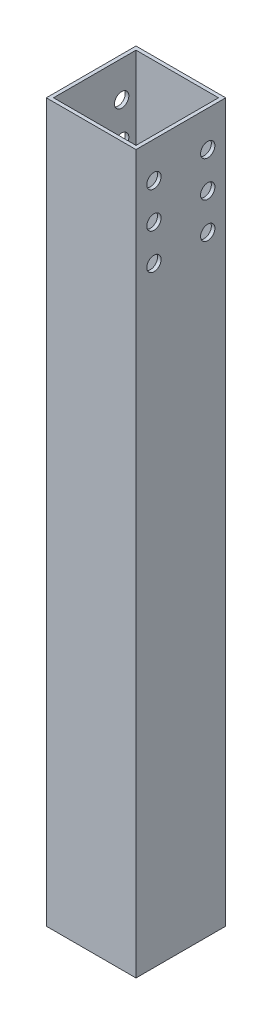
ISO-10303-21;
HEADER;
FILE_DESCRIPTION(('STEP AP214'),'2;1');
FILE_NAME('part.step','',(''),(''),'','','');
FILE_SCHEMA(('AUTOMOTIVE_DESIGN { 1 0 10303 214 1 1 1 1 }'));
ENDSEC;
DATA;
#1=APPLICATION_CONTEXT('core data for automotive mechanical design processes');
#2=APPLICATION_PROTOCOL_DEFINITION('international standard','automotive_design',2000,#1);
#3=PRODUCT_CONTEXT('',#1,'mechanical');
#4=PRODUCT('Part','Part','',(#3));
#5=PRODUCT_RELATED_PRODUCT_CATEGORY('part','',(#4));
#6=PRODUCT_DEFINITION_FORMATION('','',#4);
#7=PRODUCT_DEFINITION_CONTEXT('part definition',#1,'design');
#8=PRODUCT_DEFINITION('design','',#6,#7);
#9=PRODUCT_DEFINITION_SHAPE('','',#8);
#10=(LENGTH_UNIT() NAMED_UNIT(*) SI_UNIT(.MILLI.,.METRE.));
#11=(NAMED_UNIT(*) PLANE_ANGLE_UNIT() SI_UNIT($,.RADIAN.));
#12=(NAMED_UNIT(*) SI_UNIT($,.STERADIAN.) SOLID_ANGLE_UNIT());
#13=UNCERTAINTY_MEASURE_WITH_UNIT(LENGTH_MEASURE(1.E-05),#10,'distance_accuracy_value','');
#14=(GEOMETRIC_REPRESENTATION_CONTEXT(3) GLOBAL_UNCERTAINTY_ASSIGNED_CONTEXT((#13)) GLOBAL_UNIT_ASSIGNED_CONTEXT((#10,
#11,#12)) REPRESENTATION_CONTEXT('',''));
#15=CARTESIAN_POINT('',(0.,0.,0.));
#16=DIRECTION('',(0.,0.,1.));
#17=DIRECTION('',(1.,0.,0.));
#18=AXIS2_PLACEMENT_3D('',#15,#16,#17);
#19=CARTESIAN_POINT('',(0.,200.,0.));
#20=DIRECTION('',(0.,1.,0.));
#21=DIRECTION('',(0.,0.,1.));
#22=AXIS2_PLACEMENT_3D('',#19,#20,#21);
#23=PLANE('',#22);
#24=DIRECTION('',(0.,0.,-1.));
#25=VECTOR('',#24,1.);
#26=CARTESIAN_POINT('',(12.5,200.,-12.5));
#27=LINE('',#26,#25);
#28=CARTESIAN_POINT('',(12.5,200.,12.5));
#29=VERTEX_POINT('',#28);
#30=CARTESIAN_POINT('',(12.5,200.,-12.5));
#31=VERTEX_POINT('',#30);
#32=EDGE_CURVE('E138',#29,#31,#27,.T.);
#33=ORIENTED_EDGE('',*,*,#32,.T.);
#34=DIRECTION('',(-1.,0.,0.));
#35=VECTOR('',#34,1.);
#36=CARTESIAN_POINT('',(-12.5,200.,-12.5));
#37=LINE('',#36,#35);
#38=CARTESIAN_POINT('',(-12.5,200.,-12.5));
#39=VERTEX_POINT('',#38);
#40=EDGE_CURVE('E141',#31,#39,#37,.T.);
#41=ORIENTED_EDGE('',*,*,#40,.T.);
#42=DIRECTION('',(0.,0.,1.));
#43=VECTOR('',#42,1.);
#44=CARTESIAN_POINT('',(-12.5,200.,-12.5));
#45=LINE('',#44,#43);
#46=CARTESIAN_POINT('',(-12.5,200.,12.5));
#47=VERTEX_POINT('',#46);
#48=EDGE_CURVE('E144',#39,#47,#45,.T.);
#49=ORIENTED_EDGE('',*,*,#48,.T.);
#50=DIRECTION('',(1.,0.,0.));
#51=VECTOR('',#50,1.);
#52=CARTESIAN_POINT('',(-12.5,200.,12.5));
#53=LINE('',#52,#51);
#54=EDGE_CURVE('E146',#47,#29,#53,.T.);
#55=ORIENTED_EDGE('',*,*,#54,.T.);
#56=EDGE_LOOP('',(#33,#41,#49,#55));
#57=FACE_BOUND('',#56,.T.);
#58=DIRECTION('',(1.,0.,0.));
#59=VECTOR('',#58,1.);
#60=CARTESIAN_POINT('',(-11.5,200.,11.5));
#61=LINE('',#60,#59);
#62=CARTESIAN_POINT('',(-11.5,200.,11.5));
#63=VERTEX_POINT('',#62);
#64=CARTESIAN_POINT('',(11.5,200.,11.5));
#65=VERTEX_POINT('',#64);
#66=EDGE_CURVE('E108',#63,#65,#61,.T.);
#67=ORIENTED_EDGE('',*,*,#66,.F.);
#68=DIRECTION('',(0.,0.,1.));
#69=VECTOR('',#68,1.);
#70=CARTESIAN_POINT('',(-11.5,200.,-11.5));
#71=LINE('',#70,#69);
#72=CARTESIAN_POINT('',(-11.5,200.,-11.5));
#73=VERTEX_POINT('',#72);
#74=EDGE_CURVE('E100',#73,#63,#71,.T.);
#75=ORIENTED_EDGE('',*,*,#74,.F.);
#76=DIRECTION('',(-1.,0.,0.));
#77=VECTOR('',#76,1.);
#78=CARTESIAN_POINT('',(-11.5,200.,-11.5));
#79=LINE('',#78,#77);
#80=CARTESIAN_POINT('',(11.5,200.,-11.5));
#81=VERTEX_POINT('',#80);
#82=EDGE_CURVE('E122',#81,#73,#79,.T.);
#83=ORIENTED_EDGE('',*,*,#82,.F.);
#84=DIRECTION('',(0.,0.,-1.));
#85=VECTOR('',#84,1.);
#86=CARTESIAN_POINT('',(11.5,200.,-11.5));
#87=LINE('',#86,#85);
#88=EDGE_CURVE('E120',#65,#81,#87,.T.);
#89=ORIENTED_EDGE('',*,*,#88,.F.);
#90=EDGE_LOOP('',(#67,#75,#83,#89));
#91=FACE_BOUND('',#90,.T.);
#92=ADVANCED_FACE('F33',(#57,#91),#23,.T.);
#93=CARTESIAN_POINT('',(0.,0.,0.));
#94=DIRECTION('',(0.,1.,0.));
#95=DIRECTION('',(0.,0.,1.));
#96=AXIS2_PLACEMENT_3D('',#93,#94,#95);
#97=PLANE('',#96);
#98=DIRECTION('',(0.,0.,-1.));
#99=VECTOR('',#98,1.);
#100=CARTESIAN_POINT('',(12.5,0.,-12.5));
#101=LINE('',#100,#99);
#102=CARTESIAN_POINT('',(12.5,0.,12.5));
#103=VERTEX_POINT('',#102);
#104=CARTESIAN_POINT('',(12.5,0.,-12.5));
#105=VERTEX_POINT('',#104);
#106=EDGE_CURVE('E116',#103,#105,#101,.T.);
#107=ORIENTED_EDGE('',*,*,#106,.F.);
#108=DIRECTION('',(1.,0.,0.));
#109=VECTOR('',#108,1.);
#110=CARTESIAN_POINT('',(-12.5,0.,12.5));
#111=LINE('',#110,#109);
#112=CARTESIAN_POINT('',(-12.5,0.,12.5));
#113=VERTEX_POINT('',#112);
#114=EDGE_CURVE('E142',#113,#103,#111,.T.);
#115=ORIENTED_EDGE('',*,*,#114,.F.);
#116=DIRECTION('',(0.,0.,1.));
#117=VECTOR('',#116,1.);
#118=CARTESIAN_POINT('',(-12.5,0.,-12.5));
#119=LINE('',#118,#117);
#120=CARTESIAN_POINT('',(-12.5,0.,-12.5));
#121=VERTEX_POINT('',#120);
#122=EDGE_CURVE('E153',#121,#113,#119,.T.);
#123=ORIENTED_EDGE('',*,*,#122,.F.);
#124=DIRECTION('',(-1.,0.,0.));
#125=VECTOR('',#124,1.);
#126=CARTESIAN_POINT('',(-12.5,0.,-12.5));
#127=LINE('',#126,#125);
#128=EDGE_CURVE('E151',#105,#121,#127,.T.);
#129=ORIENTED_EDGE('',*,*,#128,.F.);
#130=EDGE_LOOP('',(#107,#115,#123,#129));
#131=FACE_BOUND('',#130,.T.);
#132=DIRECTION('',(0.,0.,1.));
#133=VECTOR('',#132,1.);
#134=CARTESIAN_POINT('',(-11.5,0.,-11.5));
#135=LINE('',#134,#133);
#136=CARTESIAN_POINT('',(-11.5,0.,-11.5));
#137=VERTEX_POINT('',#136);
#138=CARTESIAN_POINT('',(-11.5,0.,11.5));
#139=VERTEX_POINT('',#138);
#140=EDGE_CURVE('E58',#137,#139,#135,.T.);
#141=ORIENTED_EDGE('',*,*,#140,.T.);
#142=DIRECTION('',(1.,0.,0.));
#143=VECTOR('',#142,1.);
#144=CARTESIAN_POINT('',(-11.5,0.,11.5));
#145=LINE('',#144,#143);
#146=CARTESIAN_POINT('',(11.5,0.,11.5));
#147=VERTEX_POINT('',#146);
#148=EDGE_CURVE('E115',#139,#147,#145,.T.);
#149=ORIENTED_EDGE('',*,*,#148,.T.);
#150=DIRECTION('',(0.,0.,-1.));
#151=VECTOR('',#150,1.);
#152=CARTESIAN_POINT('',(11.5,0.,-11.5));
#153=LINE('',#152,#151);
#154=CARTESIAN_POINT('',(11.5,0.,-11.5));
#155=VERTEX_POINT('',#154);
#156=EDGE_CURVE('E130',#147,#155,#153,.T.);
#157=ORIENTED_EDGE('',*,*,#156,.T.);
#158=DIRECTION('',(-1.,0.,0.));
#159=VECTOR('',#158,1.);
#160=CARTESIAN_POINT('',(-11.5,0.,-11.5));
#161=LINE('',#160,#159);
#162=EDGE_CURVE('E109',#155,#137,#161,.T.);
#163=ORIENTED_EDGE('',*,*,#162,.T.);
#164=EDGE_LOOP('',(#141,#149,#157,#163));
#165=FACE_BOUND('',#164,.T.);
#166=ADVANCED_FACE('F217',(#131,#165),#97,.F.);
#167=CARTESIAN_POINT('',(12.5,200.,-12.5));
#168=DIRECTION('',(-1.,0.,0.));
#169=DIRECTION('',(0.,0.,1.));
#170=AXIS2_PLACEMENT_3D('',#167,#168,#169);
#171=PLANE('',#170);
#172=CARTESIAN_POINT('',(12.5,180.,-7.5));
#173=DIRECTION('',(1.,0.,0.));
#174=DIRECTION('',(0.,0.,-1.));
#175=AXIS2_PLACEMENT_3D('',#172,#173,#174);
#176=CIRCLE('',#175,2.);
#177=CARTESIAN_POINT('',(12.5,180.,-9.5));
#178=VERTEX_POINT('',#177);
#179=EDGE_CURVE('E270',#178,#178,#176,.T.);
#180=ORIENTED_EDGE('',*,*,#179,.F.);
#181=EDGE_LOOP('',(#180));
#182=FACE_BOUND('',#181,.T.);
#183=CARTESIAN_POINT('',(12.5,170.,-7.5));
#184=DIRECTION('',(1.,0.,0.));
#185=DIRECTION('',(0.,0.,-1.));
#186=AXIS2_PLACEMENT_3D('',#183,#184,#185);
#187=CIRCLE('',#186,2.);
#188=CARTESIAN_POINT('',(12.5,170.,-9.5));
#189=VERTEX_POINT('',#188);
#190=EDGE_CURVE('E274',#189,#189,#187,.T.);
#191=ORIENTED_EDGE('',*,*,#190,.F.);
#192=EDGE_LOOP('',(#191));
#193=FACE_BOUND('',#192,.T.);
#194=CARTESIAN_POINT('',(12.5,190.,7.5));
#195=DIRECTION('',(1.,0.,0.));
#196=DIRECTION('',(0.,0.,-1.));
#197=AXIS2_PLACEMENT_3D('',#194,#195,#196);
#198=CIRCLE('',#197,2.);
#199=CARTESIAN_POINT('',(12.5,190.,5.5));
#200=VERTEX_POINT('',#199);
#201=EDGE_CURVE('E278',#200,#200,#198,.T.);
#202=ORIENTED_EDGE('',*,*,#201,.F.);
#203=EDGE_LOOP('',(#202));
#204=FACE_BOUND('',#203,.T.);
#205=CARTESIAN_POINT('',(12.5,180.,7.5));
#206=DIRECTION('',(1.,0.,0.));
#207=DIRECTION('',(0.,0.,-1.));
#208=AXIS2_PLACEMENT_3D('',#205,#206,#207);
#209=CIRCLE('',#208,2.);
#210=CARTESIAN_POINT('',(12.5,180.,5.5));
#211=VERTEX_POINT('',#210);
#212=EDGE_CURVE('E282',#211,#211,#209,.T.);
#213=ORIENTED_EDGE('',*,*,#212,.F.);
#214=EDGE_LOOP('',(#213));
#215=FACE_BOUND('',#214,.T.);
#216=CARTESIAN_POINT('',(12.5,170.,7.5));
#217=DIRECTION('',(1.,0.,0.));
#218=DIRECTION('',(0.,0.,-1.));
#219=AXIS2_PLACEMENT_3D('',#216,#217,#218);
#220=CIRCLE('',#219,2.);
#221=CARTESIAN_POINT('',(12.5,170.,5.5));
#222=VERTEX_POINT('',#221);
#223=EDGE_CURVE('E286',#222,#222,#220,.T.);
#224=ORIENTED_EDGE('',*,*,#223,.F.);
#225=EDGE_LOOP('',(#224));
#226=FACE_BOUND('',#225,.T.);
#227=CARTESIAN_POINT('',(12.5,190.,-7.5));
#228=DIRECTION('',(1.,0.,0.));
#229=DIRECTION('',(0.,0.,-1.));
#230=AXIS2_PLACEMENT_3D('',#227,#228,#229);
#231=CIRCLE('',#230,2.);
#232=CARTESIAN_POINT('',(12.5,190.,-9.5));
#233=VERTEX_POINT('',#232);
#234=EDGE_CURVE('E289',#233,#233,#231,.T.);
#235=ORIENTED_EDGE('',*,*,#234,.F.);
#236=EDGE_LOOP('',(#235));
#237=FACE_BOUND('',#236,.T.);
#238=ORIENTED_EDGE('',*,*,#106,.T.);
#239=DIRECTION('',(0.,-1.,0.));
#240=VECTOR('',#239,1.);
#241=CARTESIAN_POINT('',(12.5,200.,-12.5));
#242=LINE('',#241,#240);
#243=EDGE_CURVE('E11',#31,#105,#242,.T.);
#244=ORIENTED_EDGE('',*,*,#243,.F.);
#245=ORIENTED_EDGE('',*,*,#32,.F.);
#246=DIRECTION('',(0.,-1.,0.));
#247=VECTOR('',#246,1.);
#248=CARTESIAN_POINT('',(12.5,200.,12.5));
#249=LINE('',#248,#247);
#250=EDGE_CURVE('E148',#29,#103,#249,.T.);
#251=ORIENTED_EDGE('',*,*,#250,.T.);
#252=EDGE_LOOP('',(#238,#244,#245,#251));
#253=FACE_BOUND('',#252,.T.);
#254=ADVANCED_FACE('F35',(#182,#193,#204,#215,#226,#237,#253),#171,.F.);
#255=CARTESIAN_POINT('',(-12.5,200.,-12.5));
#256=DIRECTION('',(0.,0.,1.));
#257=DIRECTION('',(1.,0.,0.));
#258=AXIS2_PLACEMENT_3D('',#255,#256,#257);
#259=PLANE('',#258);
#260=ORIENTED_EDGE('',*,*,#128,.T.);
#261=DIRECTION('',(0.,-1.,0.));
#262=VECTOR('',#261,1.);
#263=CARTESIAN_POINT('',(-12.5,200.,-12.5));
#264=LINE('',#263,#262);
#265=EDGE_CURVE('E42',#39,#121,#264,.T.);
#266=ORIENTED_EDGE('',*,*,#265,.F.);
#267=ORIENTED_EDGE('',*,*,#40,.F.);
#268=ORIENTED_EDGE('',*,*,#243,.T.);
#269=EDGE_LOOP('',(#260,#266,#267,#268));
#270=FACE_BOUND('',#269,.T.);
#271=ADVANCED_FACE('F245',(#270),#259,.F.);
#272=CARTESIAN_POINT('',(-12.5,200.,-12.5));
#273=DIRECTION('',(1.,0.,0.));
#274=DIRECTION('',(0.,0.,-1.));
#275=AXIS2_PLACEMENT_3D('',#272,#273,#274);
#276=PLANE('',#275);
#277=CARTESIAN_POINT('',(-12.5,180.,-7.5));
#278=DIRECTION('',(1.,0.,0.));
#279=DIRECTION('',(0.,0.,-1.));
#280=AXIS2_PLACEMENT_3D('',#277,#278,#279);
#281=CIRCLE('',#280,2.);
#282=CARTESIAN_POINT('',(-12.5,180.,-9.5));
#283=VERTEX_POINT('',#282);
#284=EDGE_CURVE('E291',#283,#283,#281,.T.);
#285=ORIENTED_EDGE('',*,*,#284,.T.);
#286=EDGE_LOOP('',(#285));
#287=FACE_BOUND('',#286,.T.);
#288=CARTESIAN_POINT('',(-12.5,170.,-7.5));
#289=DIRECTION('',(1.,0.,0.));
#290=DIRECTION('',(0.,0.,-1.));
#291=AXIS2_PLACEMENT_3D('',#288,#289,#290);
#292=CIRCLE('',#291,2.);
#293=CARTESIAN_POINT('',(-12.5,170.,-9.5));
#294=VERTEX_POINT('',#293);
#295=EDGE_CURVE('E347',#294,#294,#292,.T.);
#296=ORIENTED_EDGE('',*,*,#295,.T.);
#297=EDGE_LOOP('',(#296));
#298=FACE_BOUND('',#297,.T.);
#299=CARTESIAN_POINT('',(-12.5,190.,7.5));
#300=DIRECTION('',(1.,0.,0.));
#301=DIRECTION('',(0.,0.,-1.));
#302=AXIS2_PLACEMENT_3D('',#299,#300,#301);
#303=CIRCLE('',#302,2.);
#304=CARTESIAN_POINT('',(-12.5,190.,5.5));
#305=VERTEX_POINT('',#304);
#306=EDGE_CURVE('E351',#305,#305,#303,.T.);
#307=ORIENTED_EDGE('',*,*,#306,.T.);
#308=EDGE_LOOP('',(#307));
#309=FACE_BOUND('',#308,.T.);
#310=CARTESIAN_POINT('',(-12.5,180.,7.5));
#311=DIRECTION('',(1.,0.,0.));
#312=DIRECTION('',(0.,0.,-1.));
#313=AXIS2_PLACEMENT_3D('',#310,#311,#312);
#314=CIRCLE('',#313,2.);
#315=CARTESIAN_POINT('',(-12.5,180.,5.5));
#316=VERTEX_POINT('',#315);
#317=EDGE_CURVE('E355',#316,#316,#314,.T.);
#318=ORIENTED_EDGE('',*,*,#317,.T.);
#319=EDGE_LOOP('',(#318));
#320=FACE_BOUND('',#319,.T.);
#321=CARTESIAN_POINT('',(-12.5,170.,7.5));
#322=DIRECTION('',(1.,0.,0.));
#323=DIRECTION('',(0.,0.,-1.));
#324=AXIS2_PLACEMENT_3D('',#321,#322,#323);
#325=CIRCLE('',#324,2.);
#326=CARTESIAN_POINT('',(-12.5,170.,5.5));
#327=VERTEX_POINT('',#326);
#328=EDGE_CURVE('E341',#327,#327,#325,.T.);
#329=ORIENTED_EDGE('',*,*,#328,.T.);
#330=EDGE_LOOP('',(#329));
#331=FACE_BOUND('',#330,.T.);
#332=CARTESIAN_POINT('',(-12.5,190.,-7.5));
#333=DIRECTION('',(1.,0.,0.));
#334=DIRECTION('',(0.,0.,-1.));
#335=AXIS2_PLACEMENT_3D('',#332,#333,#334);
#336=CIRCLE('',#335,2.);
#337=CARTESIAN_POINT('',(-12.5,190.,-9.5));
#338=VERTEX_POINT('',#337);
#339=EDGE_CURVE('E167',#338,#338,#336,.T.);
#340=ORIENTED_EDGE('',*,*,#339,.T.);
#341=EDGE_LOOP('',(#340));
#342=FACE_BOUND('',#341,.T.);
#343=ORIENTED_EDGE('',*,*,#122,.T.);
#344=DIRECTION('',(0.,-1.,0.));
#345=VECTOR('',#344,1.);
#346=CARTESIAN_POINT('',(-12.5,200.,12.5));
#347=LINE('',#346,#345);
#348=EDGE_CURVE('E158',#47,#113,#347,.T.);
#349=ORIENTED_EDGE('',*,*,#348,.F.);
#350=ORIENTED_EDGE('',*,*,#48,.F.);
#351=ORIENTED_EDGE('',*,*,#265,.T.);
#352=EDGE_LOOP('',(#343,#349,#350,#351));
#353=FACE_BOUND('',#352,.T.);
#354=ADVANCED_FACE('F242',(#287,#298,#309,#320,#331,#342,#353),#276,.F.);
#355=CARTESIAN_POINT('',(-12.5,200.,12.5));
#356=DIRECTION('',(0.,0.,-1.));
#357=DIRECTION('',(-1.,0.,0.));
#358=AXIS2_PLACEMENT_3D('',#355,#356,#357);
#359=PLANE('',#358);
#360=ORIENTED_EDGE('',*,*,#114,.T.);
#361=ORIENTED_EDGE('',*,*,#250,.F.);
#362=ORIENTED_EDGE('',*,*,#54,.F.);
#363=ORIENTED_EDGE('',*,*,#348,.T.);
#364=EDGE_LOOP('',(#360,#361,#362,#363));
#365=FACE_BOUND('',#364,.T.);
#366=ADVANCED_FACE('F239',(#365),#359,.F.);
#367=CARTESIAN_POINT('',(-11.5,200.,-11.5));
#368=DIRECTION('',(1.,0.,0.));
#369=DIRECTION('',(0.,0.,-1.));
#370=AXIS2_PLACEMENT_3D('',#367,#368,#369);
#371=PLANE('',#370);
#372=CARTESIAN_POINT('',(-11.5,180.,-7.5));
#373=DIRECTION('',(1.,0.,0.));
#374=DIRECTION('',(0.,0.,-1.));
#375=AXIS2_PLACEMENT_3D('',#372,#373,#374);
#376=CIRCLE('',#375,2.);
#377=CARTESIAN_POINT('',(-11.5,180.,-9.5));
#378=VERTEX_POINT('',#377);
#379=EDGE_CURVE('E128',#378,#378,#376,.T.);
#380=ORIENTED_EDGE('',*,*,#379,.F.);
#381=EDGE_LOOP('',(#380));
#382=FACE_BOUND('',#381,.T.);
#383=CARTESIAN_POINT('',(-11.5,170.,-7.5));
#384=DIRECTION('',(1.,0.,0.));
#385=DIRECTION('',(0.,0.,-1.));
#386=AXIS2_PLACEMENT_3D('',#383,#384,#385);
#387=CIRCLE('',#386,2.);
#388=CARTESIAN_POINT('',(-11.5,170.,-9.5));
#389=VERTEX_POINT('',#388);
#390=EDGE_CURVE('E181',#389,#389,#387,.T.);
#391=ORIENTED_EDGE('',*,*,#390,.F.);
#392=EDGE_LOOP('',(#391));
#393=FACE_BOUND('',#392,.T.);
#394=CARTESIAN_POINT('',(-11.5,190.,7.5));
#395=DIRECTION('',(1.,0.,0.));
#396=DIRECTION('',(0.,0.,-1.));
#397=AXIS2_PLACEMENT_3D('',#394,#395,#396);
#398=CIRCLE('',#397,2.);
#399=CARTESIAN_POINT('',(-11.5,190.,5.5));
#400=VERTEX_POINT('',#399);
#401=EDGE_CURVE('E178',#400,#400,#398,.T.);
#402=ORIENTED_EDGE('',*,*,#401,.F.);
#403=EDGE_LOOP('',(#402));
#404=FACE_BOUND('',#403,.T.);
#405=CARTESIAN_POINT('',(-11.5,180.,7.5));
#406=DIRECTION('',(1.,0.,0.));
#407=DIRECTION('',(0.,0.,-1.));
#408=AXIS2_PLACEMENT_3D('',#405,#406,#407);
#409=CIRCLE('',#408,2.);
#410=CARTESIAN_POINT('',(-11.5,180.,5.5));
#411=VERTEX_POINT('',#410);
#412=EDGE_CURVE('E175',#411,#411,#409,.T.);
#413=ORIENTED_EDGE('',*,*,#412,.F.);
#414=EDGE_LOOP('',(#413));
#415=FACE_BOUND('',#414,.T.);
#416=CARTESIAN_POINT('',(-11.5,170.,7.5));
#417=DIRECTION('',(1.,0.,0.));
#418=DIRECTION('',(0.,0.,-1.));
#419=AXIS2_PLACEMENT_3D('',#416,#417,#418);
#420=CIRCLE('',#419,2.);
#421=CARTESIAN_POINT('',(-11.5,170.,5.5));
#422=VERTEX_POINT('',#421);
#423=EDGE_CURVE('E171',#422,#422,#420,.T.);
#424=ORIENTED_EDGE('',*,*,#423,.F.);
#425=EDGE_LOOP('',(#424));
#426=FACE_BOUND('',#425,.T.);
#427=CARTESIAN_POINT('',(-11.5,190.,-7.5));
#428=DIRECTION('',(1.,0.,0.));
#429=DIRECTION('',(0.,0.,-1.));
#430=AXIS2_PLACEMENT_3D('',#427,#428,#429);
#431=CIRCLE('',#430,2.);
#432=CARTESIAN_POINT('',(-11.5,190.,-9.5));
#433=VERTEX_POINT('',#432);
#434=EDGE_CURVE('E166',#433,#433,#431,.T.);
#435=ORIENTED_EDGE('',*,*,#434,.F.);
#436=EDGE_LOOP('',(#435));
#437=FACE_BOUND('',#436,.T.);
#438=ORIENTED_EDGE('',*,*,#140,.F.);
#439=DIRECTION('',(0.,-1.,0.));
#440=VECTOR('',#439,1.);
#441=CARTESIAN_POINT('',(-11.5,200.,-11.5));
#442=LINE('',#441,#440);
#443=EDGE_CURVE('E104',#73,#137,#442,.T.);
#444=ORIENTED_EDGE('',*,*,#443,.F.);
#445=ORIENTED_EDGE('',*,*,#74,.T.);
#446=DIRECTION('',(0.,-1.,0.));
#447=VECTOR('',#446,1.);
#448=CARTESIAN_POINT('',(-11.5,200.,11.5));
#449=LINE('',#448,#447);
#450=EDGE_CURVE('E103',#63,#139,#449,.T.);
#451=ORIENTED_EDGE('',*,*,#450,.T.);
#452=EDGE_LOOP('',(#438,#444,#445,#451));
#453=FACE_BOUND('',#452,.T.);
#454=ADVANCED_FACE('F102',(#382,#393,#404,#415,#426,#437,#453),#371,.T.);
#455=CARTESIAN_POINT('',(-11.5,200.,11.5));
#456=DIRECTION('',(0.,0.,-1.));
#457=DIRECTION('',(-1.,0.,0.));
#458=AXIS2_PLACEMENT_3D('',#455,#456,#457);
#459=PLANE('',#458);
#460=ORIENTED_EDGE('',*,*,#148,.F.);
#461=ORIENTED_EDGE('',*,*,#450,.F.);
#462=ORIENTED_EDGE('',*,*,#66,.T.);
#463=DIRECTION('',(0.,-1.,0.));
#464=VECTOR('',#463,1.);
#465=CARTESIAN_POINT('',(11.5,200.,11.5));
#466=LINE('',#465,#464);
#467=EDGE_CURVE('E117',#65,#147,#466,.T.);
#468=ORIENTED_EDGE('',*,*,#467,.T.);
#469=EDGE_LOOP('',(#460,#461,#462,#468));
#470=FACE_BOUND('',#469,.T.);
#471=ADVANCED_FACE('F112',(#470),#459,.T.);
#472=CARTESIAN_POINT('',(11.5,200.,-11.5));
#473=DIRECTION('',(-1.,0.,0.));
#474=DIRECTION('',(0.,0.,1.));
#475=AXIS2_PLACEMENT_3D('',#472,#473,#474);
#476=PLANE('',#475);
#477=CARTESIAN_POINT('',(11.5,180.,-7.5));
#478=DIRECTION('',(-1.,0.,0.));
#479=DIRECTION('',(0.,0.,1.));
#480=AXIS2_PLACEMENT_3D('',#477,#478,#479);
#481=CIRCLE('',#480,2.);
#482=CARTESIAN_POINT('',(11.5,180.,-5.5));
#483=VERTEX_POINT('',#482);
#484=EDGE_CURVE('E37',#483,#483,#481,.T.);
#485=ORIENTED_EDGE('',*,*,#484,.F.);
#486=EDGE_LOOP('',(#485));
#487=FACE_BOUND('',#486,.T.);
#488=CARTESIAN_POINT('',(11.5,170.,-7.5));
#489=DIRECTION('',(-1.,0.,0.));
#490=DIRECTION('',(0.,0.,1.));
#491=AXIS2_PLACEMENT_3D('',#488,#489,#490);
#492=CIRCLE('',#491,2.);
#493=CARTESIAN_POINT('',(11.5,170.,-5.5));
#494=VERTEX_POINT('',#493);
#495=EDGE_CURVE('E179',#494,#494,#492,.T.);
#496=ORIENTED_EDGE('',*,*,#495,.F.);
#497=EDGE_LOOP('',(#496));
#498=FACE_BOUND('',#497,.T.);
#499=CARTESIAN_POINT('',(11.5,190.,7.5));
#500=DIRECTION('',(-1.,0.,0.));
#501=DIRECTION('',(0.,0.,1.));
#502=AXIS2_PLACEMENT_3D('',#499,#500,#501);
#503=CIRCLE('',#502,2.);
#504=CARTESIAN_POINT('',(11.5,190.,9.5));
#505=VERTEX_POINT('',#504);
#506=EDGE_CURVE('E176',#505,#505,#503,.T.);
#507=ORIENTED_EDGE('',*,*,#506,.F.);
#508=EDGE_LOOP('',(#507));
#509=FACE_BOUND('',#508,.T.);
#510=CARTESIAN_POINT('',(11.5,180.,7.5));
#511=DIRECTION('',(-1.,0.,0.));
#512=DIRECTION('',(0.,0.,1.));
#513=AXIS2_PLACEMENT_3D('',#510,#511,#512);
#514=CIRCLE('',#513,2.);
#515=CARTESIAN_POINT('',(11.5,180.,9.5));
#516=VERTEX_POINT('',#515);
#517=EDGE_CURVE('E172',#516,#516,#514,.T.);
#518=ORIENTED_EDGE('',*,*,#517,.F.);
#519=EDGE_LOOP('',(#518));
#520=FACE_BOUND('',#519,.T.);
#521=CARTESIAN_POINT('',(11.5,170.,7.5));
#522=DIRECTION('',(-1.,0.,0.));
#523=DIRECTION('',(0.,0.,1.));
#524=AXIS2_PLACEMENT_3D('',#521,#522,#523);
#525=CIRCLE('',#524,2.);
#526=CARTESIAN_POINT('',(11.5,170.,9.5));
#527=VERTEX_POINT('',#526);
#528=EDGE_CURVE('E168',#527,#527,#525,.T.);
#529=ORIENTED_EDGE('',*,*,#528,.F.);
#530=EDGE_LOOP('',(#529));
#531=FACE_BOUND('',#530,.T.);
#532=CARTESIAN_POINT('',(11.5,190.,-7.5));
#533=DIRECTION('',(-1.,0.,0.));
#534=DIRECTION('',(0.,0.,1.));
#535=AXIS2_PLACEMENT_3D('',#532,#533,#534);
#536=CIRCLE('',#535,2.);
#537=CARTESIAN_POINT('',(11.5,190.,-5.5));
#538=VERTEX_POINT('',#537);
#539=EDGE_CURVE('E163',#538,#538,#536,.T.);
#540=ORIENTED_EDGE('',*,*,#539,.F.);
#541=EDGE_LOOP('',(#540));
#542=FACE_BOUND('',#541,.T.);
#543=ORIENTED_EDGE('',*,*,#156,.F.);
#544=ORIENTED_EDGE('',*,*,#467,.F.);
#545=ORIENTED_EDGE('',*,*,#88,.T.);
#546=DIRECTION('',(0.,-1.,0.));
#547=VECTOR('',#546,1.);
#548=CARTESIAN_POINT('',(11.5,200.,-11.5));
#549=LINE('',#548,#547);
#550=EDGE_CURVE('E50',#81,#155,#549,.T.);
#551=ORIENTED_EDGE('',*,*,#550,.T.);
#552=EDGE_LOOP('',(#543,#544,#545,#551));
#553=FACE_BOUND('',#552,.T.);
#554=ADVANCED_FACE('F201',(#487,#498,#509,#520,#531,#542,#553),#476,.T.);
#555=CARTESIAN_POINT('',(-11.5,200.,-11.5));
#556=DIRECTION('',(0.,0.,1.));
#557=DIRECTION('',(1.,0.,0.));
#558=AXIS2_PLACEMENT_3D('',#555,#556,#557);
#559=PLANE('',#558);
#560=ORIENTED_EDGE('',*,*,#162,.F.);
#561=ORIENTED_EDGE('',*,*,#550,.F.);
#562=ORIENTED_EDGE('',*,*,#82,.T.);
#563=ORIENTED_EDGE('',*,*,#443,.T.);
#564=EDGE_LOOP('',(#560,#561,#562,#563));
#565=FACE_BOUND('',#564,.T.);
#566=ADVANCED_FACE('F204',(#565),#559,.T.);
#567=CARTESIAN_POINT('',(-12.5,190.,-7.5));
#568=DIRECTION('',(1.,0.,0.));
#569=DIRECTION('',(0.,0.,-1.));
#570=AXIS2_PLACEMENT_3D('',#567,#568,#569);
#571=CYLINDRICAL_SURFACE('',#570,2.);
#572=ORIENTED_EDGE('',*,*,#539,.T.);
#573=EDGE_LOOP('',(#572));
#574=FACE_BOUND('',#573,.T.);
#575=ORIENTED_EDGE('',*,*,#234,.T.);
#576=EDGE_LOOP('',(#575));
#577=FACE_BOUND('',#576,.T.);
#578=ADVANCED_FACE('F219',(#574,#577),#571,.F.);
#579=CARTESIAN_POINT('',(-12.5,170.,7.5));
#580=DIRECTION('',(1.,0.,0.));
#581=DIRECTION('',(0.,0.,-1.));
#582=AXIS2_PLACEMENT_3D('',#579,#580,#581);
#583=CYLINDRICAL_SURFACE('',#582,2.);
#584=ORIENTED_EDGE('',*,*,#528,.T.);
#585=EDGE_LOOP('',(#584));
#586=FACE_BOUND('',#585,.T.);
#587=ORIENTED_EDGE('',*,*,#223,.T.);
#588=EDGE_LOOP('',(#587));
#589=FACE_BOUND('',#588,.T.);
#590=ADVANCED_FACE('F224',(#586,#589),#583,.F.);
#591=CARTESIAN_POINT('',(-12.5,180.,7.5));
#592=DIRECTION('',(1.,0.,0.));
#593=DIRECTION('',(0.,0.,-1.));
#594=AXIS2_PLACEMENT_3D('',#591,#592,#593);
#595=CYLINDRICAL_SURFACE('',#594,2.);
#596=ORIENTED_EDGE('',*,*,#517,.T.);
#597=EDGE_LOOP('',(#596));
#598=FACE_BOUND('',#597,.T.);
#599=ORIENTED_EDGE('',*,*,#212,.T.);
#600=EDGE_LOOP('',(#599));
#601=FACE_BOUND('',#600,.T.);
#602=ADVANCED_FACE('F325',(#598,#601),#595,.F.);
#603=CARTESIAN_POINT('',(-12.5,190.,7.5));
#604=DIRECTION('',(1.,0.,0.));
#605=DIRECTION('',(0.,0.,-1.));
#606=AXIS2_PLACEMENT_3D('',#603,#604,#605);
#607=CYLINDRICAL_SURFACE('',#606,2.);
#608=ORIENTED_EDGE('',*,*,#506,.T.);
#609=EDGE_LOOP('',(#608));
#610=FACE_BOUND('',#609,.T.);
#611=ORIENTED_EDGE('',*,*,#201,.T.);
#612=EDGE_LOOP('',(#611));
#613=FACE_BOUND('',#612,.T.);
#614=ADVANCED_FACE('F328',(#610,#613),#607,.F.);
#615=CARTESIAN_POINT('',(-12.5,170.,-7.5));
#616=DIRECTION('',(1.,0.,0.));
#617=DIRECTION('',(0.,0.,-1.));
#618=AXIS2_PLACEMENT_3D('',#615,#616,#617);
#619=CYLINDRICAL_SURFACE('',#618,2.);
#620=ORIENTED_EDGE('',*,*,#495,.T.);
#621=EDGE_LOOP('',(#620));
#622=FACE_BOUND('',#621,.T.);
#623=ORIENTED_EDGE('',*,*,#190,.T.);
#624=EDGE_LOOP('',(#623));
#625=FACE_BOUND('',#624,.T.);
#626=ADVANCED_FACE('F321',(#622,#625),#619,.F.);
#627=CARTESIAN_POINT('',(-12.5,180.,-7.5));
#628=DIRECTION('',(1.,0.,0.));
#629=DIRECTION('',(0.,0.,-1.));
#630=AXIS2_PLACEMENT_3D('',#627,#628,#629);
#631=CYLINDRICAL_SURFACE('',#630,2.);
#632=ORIENTED_EDGE('',*,*,#484,.T.);
#633=EDGE_LOOP('',(#632));
#634=FACE_BOUND('',#633,.T.);
#635=ORIENTED_EDGE('',*,*,#179,.T.);
#636=EDGE_LOOP('',(#635));
#637=FACE_BOUND('',#636,.T.);
#638=ADVANCED_FACE('F198',(#634,#637),#631,.F.);
#639=ORIENTED_EDGE('',*,*,#434,.T.);
#640=EDGE_LOOP('',(#639));
#641=FACE_BOUND('',#640,.T.);
#642=ORIENTED_EDGE('',*,*,#339,.F.);
#643=EDGE_LOOP('',(#642));
#644=FACE_BOUND('',#643,.T.);
#645=ADVANCED_FACE('F227',(#641,#644),#571,.F.);
#646=ORIENTED_EDGE('',*,*,#423,.T.);
#647=EDGE_LOOP('',(#646));
#648=FACE_BOUND('',#647,.T.);
#649=ORIENTED_EDGE('',*,*,#328,.F.);
#650=EDGE_LOOP('',(#649));
#651=FACE_BOUND('',#650,.T.);
#652=ADVANCED_FACE('F303',(#648,#651),#583,.F.);
#653=ORIENTED_EDGE('',*,*,#412,.T.);
#654=EDGE_LOOP('',(#653));
#655=FACE_BOUND('',#654,.T.);
#656=ORIENTED_EDGE('',*,*,#317,.F.);
#657=EDGE_LOOP('',(#656));
#658=FACE_BOUND('',#657,.T.);
#659=ADVANCED_FACE('F319',(#655,#658),#595,.F.);
#660=ORIENTED_EDGE('',*,*,#401,.T.);
#661=EDGE_LOOP('',(#660));
#662=FACE_BOUND('',#661,.T.);
#663=ORIENTED_EDGE('',*,*,#306,.F.);
#664=EDGE_LOOP('',(#663));
#665=FACE_BOUND('',#664,.T.);
#666=ADVANCED_FACE('F333',(#662,#665),#607,.F.);
#667=ORIENTED_EDGE('',*,*,#390,.T.);
#668=EDGE_LOOP('',(#667));
#669=FACE_BOUND('',#668,.T.);
#670=ORIENTED_EDGE('',*,*,#295,.F.);
#671=EDGE_LOOP('',(#670));
#672=FACE_BOUND('',#671,.T.);
#673=ADVANCED_FACE('F335',(#669,#672),#619,.F.);
#674=ORIENTED_EDGE('',*,*,#379,.T.);
#675=EDGE_LOOP('',(#674));
#676=FACE_BOUND('',#675,.T.);
#677=ORIENTED_EDGE('',*,*,#284,.F.);
#678=EDGE_LOOP('',(#677));
#679=FACE_BOUND('',#678,.T.);
#680=ADVANCED_FACE('F323',(#676,#679),#631,.F.);
#681=CLOSED_SHELL('',(#92,#166,#254,#271,#354,#366,#454,#471,#554,#566,#578,#590,#602,#614,#626,
#638,#645,#652,#659,#666,#673,#680));
#682=MANIFOLD_SOLID_BREP('B2',#681);
#683=ADVANCED_BREP_SHAPE_REPRESENTATION('',(#18,#682),#14);
#684=SHAPE_DEFINITION_REPRESENTATION(#9,#683);
ENDSEC;
END-ISO-10303-21;
